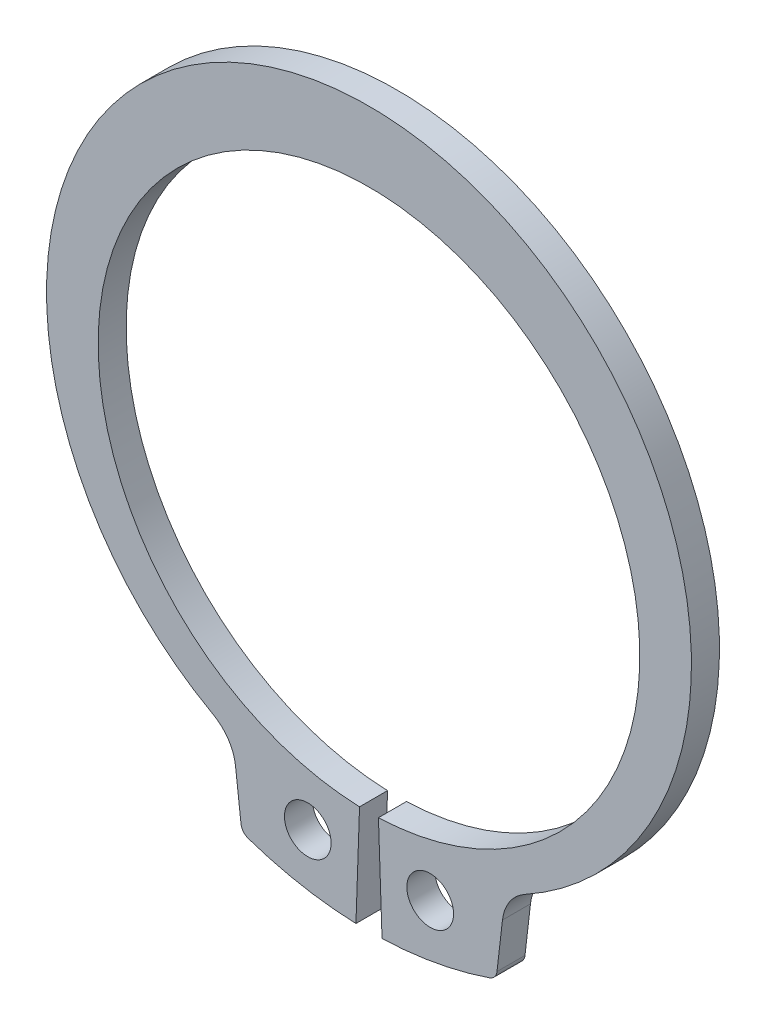
ISO-10303-21;
HEADER;
FILE_DESCRIPTION(('STEP AP214'),'2;1');
FILE_NAME('part.step','',(''),(''),'','','');
FILE_SCHEMA(('AUTOMOTIVE_DESIGN { 1 0 10303 214 1 1 1 1 }'));
ENDSEC;
DATA;
#1=APPLICATION_CONTEXT('core data for automotive mechanical design processes');
#2=APPLICATION_PROTOCOL_DEFINITION('international standard','automotive_design',2000,#1);
#3=PRODUCT_CONTEXT('',#1,'mechanical');
#4=PRODUCT('Part','Part','',(#3));
#5=PRODUCT_RELATED_PRODUCT_CATEGORY('part','',(#4));
#6=PRODUCT_DEFINITION_FORMATION('','',#4);
#7=PRODUCT_DEFINITION_CONTEXT('part definition',#1,'design');
#8=PRODUCT_DEFINITION('design','',#6,#7);
#9=PRODUCT_DEFINITION_SHAPE('','',#8);
#10=(LENGTH_UNIT() NAMED_UNIT(*) SI_UNIT(.MILLI.,.METRE.));
#11=(NAMED_UNIT(*) PLANE_ANGLE_UNIT() SI_UNIT($,.RADIAN.));
#12=(NAMED_UNIT(*) SI_UNIT($,.STERADIAN.) SOLID_ANGLE_UNIT());
#13=UNCERTAINTY_MEASURE_WITH_UNIT(LENGTH_MEASURE(1.E-05),#10,'distance_accuracy_value','');
#14=(GEOMETRIC_REPRESENTATION_CONTEXT(3) GLOBAL_UNCERTAINTY_ASSIGNED_CONTEXT((#13)) GLOBAL_UNIT_ASSIGNED_CONTEXT((#10,
#11,#12)) REPRESENTATION_CONTEXT('',''));
#15=CARTESIAN_POINT('',(0.,0.,0.));
#16=DIRECTION('',(0.,0.,1.));
#17=DIRECTION('',(1.,0.,0.));
#18=AXIS2_PLACEMENT_3D('',#15,#16,#17);
#19=CARTESIAN_POINT('',(0.,0.789014919272689,0.6));
#20=DIRECTION('',(0.,0.,1.));
#21=DIRECTION('',(1.,0.,0.));
#22=AXIS2_PLACEMENT_3D('',#19,#20,#21);
#23=PLANE('',#22);
#24=DIRECTION('',(0.114755989276099,-0.993393709928377,0.));
#25=VECTOR('',#24,1.);
#26=CARTESIAN_POINT('',(-5.44782224700734,-15.054348692698,0.6));
#27=LINE('',#26,#25);
#28=CARTESIAN_POINT('',(-5.7159600551779,-12.73319392151,0.6));
#29=VERTEX_POINT('',#28);
#30=CARTESIAN_POINT('',(-5.48160242267213,-14.7619281032598,0.6));
#31=VERTEX_POINT('',#30);
#32=EDGE_CURVE('E189',#29,#31,#27,.T.);
#33=ORIENTED_EDGE('',*,*,#32,.T.);
#34=CARTESIAN_POINT('',(-5.01405938593886,-14.7079179326968,0.6));
#35=DIRECTION('',(0.,0.,1.));
#36=DIRECTION('',(1.,0.,0.));
#37=AXIS2_PLACEMENT_3D('',#34,#35,#36);
#38=CIRCLE('',#37,0.470652302365579);
#39=CARTESIAN_POINT('',(-5.16592651675523,-15.1533951647745,0.6));
#40=VERTEX_POINT('',#39);
#41=EDGE_CURVE('E12',#31,#40,#38,.T.);
#42=ORIENTED_EDGE('',*,*,#41,.T.);
#43=CARTESIAN_POINT('',(0.,0.,0.6));
#44=DIRECTION('',(0.,0.,1.));
#45=DIRECTION('',(1.,0.,0.));
#46=AXIS2_PLACEMENT_3D('',#43,#44,#45);
#47=CIRCLE('',#46,16.0097527087811);
#48=CARTESIAN_POINT('',(-0.558732311867989,-16.,0.6));
#49=VERTEX_POINT('',#48);
#50=EDGE_CURVE('E192',#40,#49,#47,.T.);
#51=ORIENTED_EDGE('',*,*,#50,.T.);
#52=DIRECTION('',(0.0348994967025029,0.999390827019096,0.));
#53=VECTOR('',#52,1.);
#54=CARTESIAN_POINT('',(-0.558732311867989,-16.,0.6));
#55=LINE('',#54,#53);
#56=CARTESIAN_POINT('',(-0.404834161749029,-11.5929335934215,0.6));
#57=VERTEX_POINT('',#56);
#58=EDGE_CURVE('E194',#49,#57,#55,.T.);
#59=ORIENTED_EDGE('',*,*,#58,.T.);
#60=CARTESIAN_POINT('',(0.,0.,0.6));
#61=DIRECTION('',(0.,0.,-1.));
#62=DIRECTION('',(1.,0.,0.));
#63=AXIS2_PLACEMENT_3D('',#60,#61,#62);
#64=CIRCLE('',#63,11.6);
#65=CARTESIAN_POINT('',(0.404834161749023,-11.5929335934215,0.6));
#66=VERTEX_POINT('',#65);
#67=EDGE_CURVE('E148',#57,#66,#64,.T.);
#68=ORIENTED_EDGE('',*,*,#67,.T.);
#69=DIRECTION('',(-0.0348994967025024,0.999390827019096,0.));
#70=VECTOR('',#69,1.);
#71=CARTESIAN_POINT('',(0.55873231186798,-16.,0.6));
#72=LINE('',#71,#70);
#73=CARTESIAN_POINT('',(0.55873231186798,-16.,0.6));
#74=VERTEX_POINT('',#73);
#75=EDGE_CURVE('E128',#74,#66,#72,.T.);
#76=ORIENTED_EDGE('',*,*,#75,.F.);
#77=CARTESIAN_POINT('',(0.,0.,0.6));
#78=DIRECTION('',(0.,0.,-1.));
#79=DIRECTION('',(-1.,0.,0.));
#80=AXIS2_PLACEMENT_3D('',#77,#78,#79);
#81=CIRCLE('',#80,16.0097527087811);
#82=CARTESIAN_POINT('',(5.16592651675522,-15.1533951647745,0.6));
#83=VERTEX_POINT('',#82);
#84=EDGE_CURVE('E138',#83,#74,#81,.T.);
#85=ORIENTED_EDGE('',*,*,#84,.F.);
#86=CARTESIAN_POINT('',(5.01405938593885,-14.7079179326968,0.6));
#87=DIRECTION('',(0.,0.,-1.));
#88=DIRECTION('',(-1.,0.,0.));
#89=AXIS2_PLACEMENT_3D('',#86,#87,#88);
#90=CIRCLE('',#89,0.470652302365579);
#91=CARTESIAN_POINT('',(5.48160242267212,-14.7619281032598,0.6));
#92=VERTEX_POINT('',#91);
#93=EDGE_CURVE('E177',#92,#83,#90,.T.);
#94=ORIENTED_EDGE('',*,*,#93,.F.);
#95=DIRECTION('',(-0.1147559892761,-0.993393709928377,0.));
#96=VECTOR('',#95,1.);
#97=CARTESIAN_POINT('',(5.44782224700733,-15.054348692698,0.6));
#98=LINE('',#97,#96);
#99=CARTESIAN_POINT('',(5.71596005517789,-12.73319392151,0.6));
#100=VERTEX_POINT('',#99);
#101=EDGE_CURVE('E144',#100,#92,#98,.T.);
#102=ORIENTED_EDGE('',*,*,#101,.F.);
#103=CARTESIAN_POINT('',(7.58613220211099,-12.9492346037622,0.6));
#104=DIRECTION('',(0.,0.,-1.));
#105=DIRECTION('',(-1.,0.,0.));
#106=AXIS2_PLACEMENT_3D('',#103,#104,#105);
#107=CIRCLE('',#106,1.88260920946232);
#108=CARTESIAN_POINT('',(6.67609705759215,-11.3011892550861,0.6));
#109=VERTEX_POINT('',#108);
#110=EDGE_CURVE('E168',#109,#100,#107,.F.);
#111=ORIENTED_EDGE('',*,*,#110,.F.);
#112=CARTESIAN_POINT('',(0.,0.789014919272689,0.6));
#113=DIRECTION('',(0.,0.,1.));
#114=DIRECTION('',(1.,0.,0.));
#115=AXIS2_PLACEMENT_3D('',#112,#113,#114);
#116=CIRCLE('',#115,13.8109850807273);
#117=CARTESIAN_POINT('',(-6.67609705759215,-11.3011892550861,0.6));
#118=VERTEX_POINT('',#117);
#119=EDGE_CURVE('E186',#109,#118,#116,.T.);
#120=ORIENTED_EDGE('',*,*,#119,.T.);
#121=CARTESIAN_POINT('',(-7.586132202111,-12.9492346037622,0.6));
#122=DIRECTION('',(0.,0.,1.));
#123=DIRECTION('',(1.,0.,0.));
#124=AXIS2_PLACEMENT_3D('',#121,#122,#123);
#125=CIRCLE('',#124,1.88260920946232);
#126=EDGE_CURVE('E219',#118,#29,#125,.F.);
#127=ORIENTED_EDGE('',*,*,#126,.T.);
#128=EDGE_LOOP('',(#33,#42,#51,#59,#68,#76,#85,#94,#102,#111,#120,#127));
#129=FACE_BOUND('',#128,.T.);
#130=CARTESIAN_POINT('',(-2.62156105906442,-13.5536721508825,0.6));
#131=DIRECTION('',(0.,0.,1.));
#132=DIRECTION('',(1.,0.,0.));
#133=AXIS2_PLACEMENT_3D('',#130,#131,#132);
#134=CIRCLE('',#133,1.);
#135=CARTESIAN_POINT('',(-1.62156105906442,-13.5536721508825,0.6));
#136=VERTEX_POINT('',#135);
#137=EDGE_CURVE('E180',#136,#136,#134,.T.);
#138=ORIENTED_EDGE('',*,*,#137,.F.);
#139=EDGE_LOOP('',(#138));
#140=FACE_BOUND('',#139,.T.);
#141=CARTESIAN_POINT('',(2.62156105906441,-13.5536721508825,0.6));
#142=DIRECTION('',(0.,0.,-1.));
#143=DIRECTION('',(-1.,0.,0.));
#144=AXIS2_PLACEMENT_3D('',#141,#142,#143);
#145=CIRCLE('',#144,1.);
#146=CARTESIAN_POINT('',(1.62156105906441,-13.5536721508825,0.6));
#147=VERTEX_POINT('',#146);
#148=EDGE_CURVE('E158',#147,#147,#145,.T.);
#149=ORIENTED_EDGE('',*,*,#148,.T.);
#150=EDGE_LOOP('',(#149));
#151=FACE_BOUND('',#150,.T.);
#152=ADVANCED_FACE('F34',(#129,#140,#151),#23,.T.);
#153=CARTESIAN_POINT('',(0.,0.789014919272689,-0.6));
#154=DIRECTION('',(0.,0.,1.));
#155=DIRECTION('',(1.,0.,0.));
#156=AXIS2_PLACEMENT_3D('',#153,#154,#155);
#157=PLANE('',#156);
#158=CARTESIAN_POINT('',(0.,0.,-0.6));
#159=DIRECTION('',(0.,0.,1.));
#160=DIRECTION('',(1.,0.,0.));
#161=AXIS2_PLACEMENT_3D('',#158,#159,#160);
#162=CIRCLE('',#161,16.0097527087811);
#163=CARTESIAN_POINT('',(-5.16592651675523,-15.1533951647745,-0.6));
#164=VERTEX_POINT('',#163);
#165=CARTESIAN_POINT('',(-0.558732311867989,-16.,-0.6));
#166=VERTEX_POINT('',#165);
#167=EDGE_CURVE('E202',#164,#166,#162,.T.);
#168=ORIENTED_EDGE('',*,*,#167,.F.);
#169=CARTESIAN_POINT('',(-5.01405938593886,-14.7079179326968,-0.6));
#170=DIRECTION('',(0.,0.,1.));
#171=DIRECTION('',(1.,0.,0.));
#172=AXIS2_PLACEMENT_3D('',#169,#170,#171);
#173=CIRCLE('',#172,0.470652302365579);
#174=CARTESIAN_POINT('',(-5.48160242267213,-14.7619281032598,-0.6));
#175=VERTEX_POINT('',#174);
#176=EDGE_CURVE('E56',#164,#175,#173,.F.);
#177=ORIENTED_EDGE('',*,*,#176,.T.);
#178=DIRECTION('',(0.114755989276099,-0.993393709928377,0.));
#179=VECTOR('',#178,1.);
#180=CARTESIAN_POINT('',(-5.44782224700734,-15.054348692698,-0.6));
#181=LINE('',#180,#179);
#182=CARTESIAN_POINT('',(-5.7159600551779,-12.73319392151,-0.6));
#183=VERTEX_POINT('',#182);
#184=EDGE_CURVE('E200',#183,#175,#181,.T.);
#185=ORIENTED_EDGE('',*,*,#184,.F.);
#186=CARTESIAN_POINT('',(-7.586132202111,-12.9492346037622,-0.6));
#187=DIRECTION('',(0.,0.,1.));
#188=DIRECTION('',(1.,0.,0.));
#189=AXIS2_PLACEMENT_3D('',#186,#187,#188);
#190=CIRCLE('',#189,1.88260920946232);
#191=CARTESIAN_POINT('',(-6.67609705759215,-11.3011892550861,-0.6));
#192=VERTEX_POINT('',#191);
#193=EDGE_CURVE('E217',#183,#192,#190,.T.);
#194=ORIENTED_EDGE('',*,*,#193,.T.);
#195=CARTESIAN_POINT('',(0.,0.789014919272689,-0.6));
#196=DIRECTION('',(0.,0.,1.));
#197=DIRECTION('',(1.,0.,0.));
#198=AXIS2_PLACEMENT_3D('',#195,#196,#197);
#199=CIRCLE('',#198,13.8109850807273);
#200=CARTESIAN_POINT('',(6.67609705759215,-11.3011892550861,-0.6));
#201=VERTEX_POINT('',#200);
#202=EDGE_CURVE('E183',#201,#192,#199,.T.);
#203=ORIENTED_EDGE('',*,*,#202,.F.);
#204=CARTESIAN_POINT('',(7.58613220211099,-12.9492346037622,-0.6));
#205=DIRECTION('',(0.,0.,-1.));
#206=DIRECTION('',(-1.,0.,0.));
#207=AXIS2_PLACEMENT_3D('',#204,#205,#206);
#208=CIRCLE('',#207,1.88260920946232);
#209=CARTESIAN_POINT('',(5.71596005517789,-12.73319392151,-0.6));
#210=VERTEX_POINT('',#209);
#211=EDGE_CURVE('E165',#210,#201,#208,.T.);
#212=ORIENTED_EDGE('',*,*,#211,.F.);
#213=DIRECTION('',(-0.1147559892761,-0.993393709928377,0.));
#214=VECTOR('',#213,1.);
#215=CARTESIAN_POINT('',(5.44782224700733,-15.054348692698,-0.6));
#216=LINE('',#215,#214);
#217=CARTESIAN_POINT('',(5.48160242267212,-14.7619281032598,-0.6));
#218=VERTEX_POINT('',#217);
#219=EDGE_CURVE('E154',#210,#218,#216,.T.);
#220=ORIENTED_EDGE('',*,*,#219,.T.);
#221=CARTESIAN_POINT('',(5.01405938593885,-14.7079179326968,-0.6));
#222=DIRECTION('',(0.,0.,-1.));
#223=DIRECTION('',(-1.,0.,0.));
#224=AXIS2_PLACEMENT_3D('',#221,#222,#223);
#225=CIRCLE('',#224,0.470652302365579);
#226=CARTESIAN_POINT('',(5.16592651675522,-15.1533951647745,-0.6));
#227=VERTEX_POINT('',#226);
#228=EDGE_CURVE('E172',#227,#218,#225,.F.);
#229=ORIENTED_EDGE('',*,*,#228,.F.);
#230=CARTESIAN_POINT('',(0.,0.,-0.6));
#231=DIRECTION('',(0.,0.,-1.));
#232=DIRECTION('',(-1.,0.,0.));
#233=AXIS2_PLACEMENT_3D('',#230,#231,#232);
#234=CIRCLE('',#233,16.0097527087811);
#235=CARTESIAN_POINT('',(0.55873231186798,-16.,-0.6));
#236=VERTEX_POINT('',#235);
#237=EDGE_CURVE('E157',#227,#236,#234,.T.);
#238=ORIENTED_EDGE('',*,*,#237,.T.);
#239=DIRECTION('',(-0.0348994967025024,0.999390827019096,0.));
#240=VECTOR('',#239,1.);
#241=CARTESIAN_POINT('',(0.55873231186798,-16.,-0.6));
#242=LINE('',#241,#240);
#243=CARTESIAN_POINT('',(0.404834161749023,-11.5929335934215,-0.6));
#244=VERTEX_POINT('',#243);
#245=EDGE_CURVE('E130',#236,#244,#242,.T.);
#246=ORIENTED_EDGE('',*,*,#245,.T.);
#247=CARTESIAN_POINT('',(0.,0.,-0.6));
#248=DIRECTION('',(0.,0.,-1.));
#249=DIRECTION('',(1.,0.,0.));
#250=AXIS2_PLACEMENT_3D('',#247,#248,#249);
#251=CIRCLE('',#250,11.6);
#252=CARTESIAN_POINT('',(-0.404834161749029,-11.5929335934215,-0.6));
#253=VERTEX_POINT('',#252);
#254=EDGE_CURVE('E190',#253,#244,#251,.T.);
#255=ORIENTED_EDGE('',*,*,#254,.F.);
#256=DIRECTION('',(0.0348994967025029,0.999390827019096,0.));
#257=VECTOR('',#256,1.);
#258=CARTESIAN_POINT('',(-0.558732311867989,-16.,-0.6));
#259=LINE('',#258,#257);
#260=EDGE_CURVE('E204',#166,#253,#259,.T.);
#261=ORIENTED_EDGE('',*,*,#260,.F.);
#262=EDGE_LOOP('',(#168,#177,#185,#194,#203,#212,#220,#229,#238,#246,#255,#261));
#263=FACE_BOUND('',#262,.T.);
#264=CARTESIAN_POINT('',(-2.62156105906442,-13.5536721508825,-0.6));
#265=DIRECTION('',(0.,0.,1.));
#266=DIRECTION('',(1.,0.,0.));
#267=AXIS2_PLACEMENT_3D('',#264,#265,#266);
#268=CIRCLE('',#267,1.);
#269=CARTESIAN_POINT('',(-1.62156105906442,-13.5536721508825,-0.6));
#270=VERTEX_POINT('',#269);
#271=EDGE_CURVE('E179',#270,#270,#268,.T.);
#272=ORIENTED_EDGE('',*,*,#271,.T.);
#273=EDGE_LOOP('',(#272));
#274=FACE_BOUND('',#273,.T.);
#275=CARTESIAN_POINT('',(2.62156105906441,-13.5536721508825,-0.6));
#276=DIRECTION('',(0.,0.,-1.));
#277=DIRECTION('',(-1.,0.,0.));
#278=AXIS2_PLACEMENT_3D('',#275,#276,#277);
#279=CIRCLE('',#278,1.);
#280=CARTESIAN_POINT('',(1.62156105906441,-13.5536721508825,-0.6));
#281=VERTEX_POINT('',#280);
#282=EDGE_CURVE('E252',#281,#281,#279,.T.);
#283=ORIENTED_EDGE('',*,*,#282,.F.);
#284=EDGE_LOOP('',(#283));
#285=FACE_BOUND('',#284,.T.);
#286=ADVANCED_FACE('F232',(#263,#274,#285),#157,.F.);
#287=CARTESIAN_POINT('',(0.,0.789014919272689,0.6));
#288=DIRECTION('',(0.,0.,-1.));
#289=DIRECTION('',(-1.,0.,0.));
#290=AXIS2_PLACEMENT_3D('',#287,#288,#289);
#291=CYLINDRICAL_SURFACE('',#290,13.8109850807273);
#292=ORIENTED_EDGE('',*,*,#202,.T.);
#293=DIRECTION('',(0.,0.,-1.));
#294=VECTOR('',#293,1.);
#295=CARTESIAN_POINT('',(-6.67609705759215,-11.3011892550861,0.6));
#296=LINE('',#295,#294);
#297=EDGE_CURVE('E215',#192,#118,#296,.F.);
#298=ORIENTED_EDGE('',*,*,#297,.T.);
#299=ORIENTED_EDGE('',*,*,#119,.F.);
#300=DIRECTION('',(0.,0.,-1.));
#301=VECTOR('',#300,1.);
#302=CARTESIAN_POINT('',(6.67609705759215,-11.3011892550861,0.6));
#303=LINE('',#302,#301);
#304=EDGE_CURVE('E162',#201,#109,#303,.F.);
#305=ORIENTED_EDGE('',*,*,#304,.F.);
#306=EDGE_LOOP('',(#292,#298,#299,#305));
#307=FACE_BOUND('',#306,.T.);
#308=ADVANCED_FACE('F267',(#307),#291,.T.);
#309=CARTESIAN_POINT('',(-5.44782224700734,-15.054348692698,0.6));
#310=DIRECTION('',(0.993393709928377,0.114755989276099,0.));
#311=DIRECTION('',(-0.114755989276099,0.993393709928377,0.));
#312=AXIS2_PLACEMENT_3D('',#309,#310,#311);
#313=PLANE('',#312);
#314=ORIENTED_EDGE('',*,*,#184,.T.);
#315=DIRECTION('',(0.,0.,-1.));
#316=VECTOR('',#315,1.);
#317=CARTESIAN_POINT('',(-5.48160242267213,-14.7619281032598,0.6));
#318=LINE('',#317,#316);
#319=EDGE_CURVE('E42',#175,#31,#318,.F.);
#320=ORIENTED_EDGE('',*,*,#319,.T.);
#321=ORIENTED_EDGE('',*,*,#32,.F.);
#322=DIRECTION('',(0.,0.,1.));
#323=VECTOR('',#322,1.);
#324=CARTESIAN_POINT('',(-5.7159600551779,-12.73319392151,-0.6));
#325=LINE('',#324,#323);
#326=EDGE_CURVE('E212',#29,#183,#325,.F.);
#327=ORIENTED_EDGE('',*,*,#326,.T.);
#328=EDGE_LOOP('',(#314,#320,#321,#327));
#329=FACE_BOUND('',#328,.T.);
#330=ADVANCED_FACE('F273',(#329),#313,.F.);
#331=CARTESIAN_POINT('',(0.,0.,0.6));
#332=DIRECTION('',(0.,0.,-1.));
#333=DIRECTION('',(-1.,0.,0.));
#334=AXIS2_PLACEMENT_3D('',#331,#332,#333);
#335=CYLINDRICAL_SURFACE('',#334,16.0097527087811);
#336=ORIENTED_EDGE('',*,*,#50,.F.);
#337=DIRECTION('',(0.,0.,-1.));
#338=VECTOR('',#337,1.);
#339=CARTESIAN_POINT('',(-5.16592651675523,-15.1533951647745,0.6));
#340=LINE('',#339,#338);
#341=EDGE_CURVE('E221',#40,#164,#340,.T.);
#342=ORIENTED_EDGE('',*,*,#341,.T.);
#343=ORIENTED_EDGE('',*,*,#167,.T.);
#344=DIRECTION('',(0.,0.,-1.));
#345=VECTOR('',#344,1.);
#346=CARTESIAN_POINT('',(-0.558732311867989,-16.,0.6));
#347=LINE('',#346,#345);
#348=EDGE_CURVE('E209',#49,#166,#347,.T.);
#349=ORIENTED_EDGE('',*,*,#348,.F.);
#350=EDGE_LOOP('',(#336,#342,#343,#349));
#351=FACE_BOUND('',#350,.T.);
#352=ADVANCED_FACE('F227',(#351),#335,.T.);
#353=CARTESIAN_POINT('',(-0.558732311867989,-16.,0.6));
#354=DIRECTION('',(-0.999390827019096,0.0348994967025029,0.));
#355=DIRECTION('',(-0.0348994967025029,-0.999390827019096,0.));
#356=AXIS2_PLACEMENT_3D('',#353,#354,#355);
#357=PLANE('',#356);
#358=ORIENTED_EDGE('',*,*,#260,.T.);
#359=DIRECTION('',(0.,0.,-1.));
#360=VECTOR('',#359,1.);
#361=CARTESIAN_POINT('',(-0.404834161749029,-11.5929335934215,0.6));
#362=LINE('',#361,#360);
#363=EDGE_CURVE('E197',#57,#253,#362,.T.);
#364=ORIENTED_EDGE('',*,*,#363,.F.);
#365=ORIENTED_EDGE('',*,*,#58,.F.);
#366=ORIENTED_EDGE('',*,*,#348,.T.);
#367=EDGE_LOOP('',(#358,#364,#365,#366));
#368=FACE_BOUND('',#367,.T.);
#369=ADVANCED_FACE('F237',(#368),#357,.F.);
#370=CARTESIAN_POINT('',(0.,0.,0.6));
#371=DIRECTION('',(0.,0.,-1.));
#372=DIRECTION('',(-1.,0.,0.));
#373=AXIS2_PLACEMENT_3D('',#370,#371,#372);
#374=CYLINDRICAL_SURFACE('',#373,11.6);
#375=ORIENTED_EDGE('',*,*,#254,.T.);
#376=DIRECTION('',(0.,0.,-1.));
#377=VECTOR('',#376,1.);
#378=CARTESIAN_POINT('',(0.404834161749023,-11.5929335934215,0.6));
#379=LINE('',#378,#377);
#380=EDGE_CURVE('E135',#66,#244,#379,.T.);
#381=ORIENTED_EDGE('',*,*,#380,.F.);
#382=ORIENTED_EDGE('',*,*,#67,.F.);
#383=ORIENTED_EDGE('',*,*,#363,.T.);
#384=EDGE_LOOP('',(#375,#381,#382,#383));
#385=FACE_BOUND('',#384,.T.);
#386=ADVANCED_FACE('F240',(#385),#374,.F.);
#387=CARTESIAN_POINT('',(-2.62156105906442,-13.5536721508825,0.6));
#388=DIRECTION('',(0.,0.,-1.));
#389=DIRECTION('',(-1.,0.,0.));
#390=AXIS2_PLACEMENT_3D('',#387,#388,#389);
#391=CYLINDRICAL_SURFACE('',#390,1.);
#392=ORIENTED_EDGE('',*,*,#137,.T.);
#393=EDGE_LOOP('',(#392));
#394=FACE_BOUND('',#393,.T.);
#395=ORIENTED_EDGE('',*,*,#271,.F.);
#396=EDGE_LOOP('',(#395));
#397=FACE_BOUND('',#396,.T.);
#398=ADVANCED_FACE('F281',(#394,#397),#391,.F.);
#399=CARTESIAN_POINT('',(-7.586132202111,-12.9492346037622,0.6));
#400=DIRECTION('',(0.,0.,-1.));
#401=DIRECTION('',(-1.,0.,0.));
#402=AXIS2_PLACEMENT_3D('',#399,#400,#401);
#403=CYLINDRICAL_SURFACE('',#402,1.88260920946232);
#404=ORIENTED_EDGE('',*,*,#126,.F.);
#405=ORIENTED_EDGE('',*,*,#297,.F.);
#406=ORIENTED_EDGE('',*,*,#193,.F.);
#407=ORIENTED_EDGE('',*,*,#326,.F.);
#408=EDGE_LOOP('',(#404,#405,#406,#407));
#409=FACE_BOUND('',#408,.T.);
#410=ADVANCED_FACE('F287',(#409),#403,.F.);
#411=CARTESIAN_POINT('',(-5.01405938593886,-14.7079179326968,0.6));
#412=DIRECTION('',(0.,0.,-1.));
#413=DIRECTION('',(-1.,0.,0.));
#414=AXIS2_PLACEMENT_3D('',#411,#412,#413);
#415=CYLINDRICAL_SURFACE('',#414,0.470652302365579);
#416=ORIENTED_EDGE('',*,*,#41,.F.);
#417=ORIENTED_EDGE('',*,*,#319,.F.);
#418=ORIENTED_EDGE('',*,*,#176,.F.);
#419=ORIENTED_EDGE('',*,*,#341,.F.);
#420=EDGE_LOOP('',(#416,#417,#418,#419));
#421=FACE_BOUND('',#420,.T.);
#422=ADVANCED_FACE('F36',(#421),#415,.T.);
#423=CARTESIAN_POINT('',(5.44782224700733,-15.054348692698,0.6));
#424=DIRECTION('',(-0.993393709928377,0.1147559892761,0.));
#425=DIRECTION('',(0.1147559892761,0.993393709928377,0.));
#426=AXIS2_PLACEMENT_3D('',#423,#424,#425);
#427=PLANE('',#426);
#428=ORIENTED_EDGE('',*,*,#219,.F.);
#429=DIRECTION('',(0.,0.,1.));
#430=VECTOR('',#429,1.);
#431=CARTESIAN_POINT('',(5.71596005517789,-12.73319392151,-0.6));
#432=LINE('',#431,#430);
#433=EDGE_CURVE('E134',#100,#210,#432,.F.);
#434=ORIENTED_EDGE('',*,*,#433,.F.);
#435=ORIENTED_EDGE('',*,*,#101,.T.);
#436=DIRECTION('',(0.,0.,-1.));
#437=VECTOR('',#436,1.);
#438=CARTESIAN_POINT('',(5.48160242267212,-14.7619281032598,0.6));
#439=LINE('',#438,#437);
#440=EDGE_CURVE('E175',#218,#92,#439,.F.);
#441=ORIENTED_EDGE('',*,*,#440,.F.);
#442=EDGE_LOOP('',(#428,#434,#435,#441));
#443=FACE_BOUND('',#442,.T.);
#444=ADVANCED_FACE('F250',(#443),#427,.F.);
#445=CARTESIAN_POINT('',(0.,0.,0.6));
#446=DIRECTION('',(0.,0.,-1.));
#447=DIRECTION('',(1.,0.,0.));
#448=AXIS2_PLACEMENT_3D('',#445,#446,#447);
#449=CYLINDRICAL_SURFACE('',#448,16.0097527087811);
#450=ORIENTED_EDGE('',*,*,#84,.T.);
#451=DIRECTION('',(0.,0.,-1.));
#452=VECTOR('',#451,1.);
#453=CARTESIAN_POINT('',(0.55873231186798,-16.,0.6));
#454=LINE('',#453,#452);
#455=EDGE_CURVE('E123',#74,#236,#454,.T.);
#456=ORIENTED_EDGE('',*,*,#455,.T.);
#457=ORIENTED_EDGE('',*,*,#237,.F.);
#458=DIRECTION('',(0.,0.,-1.));
#459=VECTOR('',#458,1.);
#460=CARTESIAN_POINT('',(5.16592651675522,-15.1533951647745,0.6));
#461=LINE('',#460,#459);
#462=EDGE_CURVE('E140',#83,#227,#461,.T.);
#463=ORIENTED_EDGE('',*,*,#462,.F.);
#464=EDGE_LOOP('',(#450,#456,#457,#463));
#465=FACE_BOUND('',#464,.T.);
#466=ADVANCED_FACE('F139',(#465),#449,.T.);
#467=CARTESIAN_POINT('',(0.55873231186798,-16.,0.6));
#468=DIRECTION('',(0.999390827019096,0.0348994967025024,0.));
#469=DIRECTION('',(0.0348994967025024,-0.999390827019096,0.));
#470=AXIS2_PLACEMENT_3D('',#467,#468,#469);
#471=PLANE('',#470);
#472=ORIENTED_EDGE('',*,*,#245,.F.);
#473=ORIENTED_EDGE('',*,*,#455,.F.);
#474=ORIENTED_EDGE('',*,*,#75,.T.);
#475=ORIENTED_EDGE('',*,*,#380,.T.);
#476=EDGE_LOOP('',(#472,#473,#474,#475));
#477=FACE_BOUND('',#476,.T.);
#478=ADVANCED_FACE('F125',(#477),#471,.F.);
#479=CARTESIAN_POINT('',(2.62156105906441,-13.5536721508825,0.6));
#480=DIRECTION('',(0.,0.,-1.));
#481=DIRECTION('',(1.,0.,0.));
#482=AXIS2_PLACEMENT_3D('',#479,#480,#481);
#483=CYLINDRICAL_SURFACE('',#482,1.);
#484=ORIENTED_EDGE('',*,*,#148,.F.);
#485=EDGE_LOOP('',(#484));
#486=FACE_BOUND('',#485,.T.);
#487=ORIENTED_EDGE('',*,*,#282,.T.);
#488=EDGE_LOOP('',(#487));
#489=FACE_BOUND('',#488,.T.);
#490=ADVANCED_FACE('F259',(#486,#489),#483,.F.);
#491=CARTESIAN_POINT('',(7.58613220211099,-12.9492346037622,0.6));
#492=DIRECTION('',(0.,0.,-1.));
#493=DIRECTION('',(1.,0.,0.));
#494=AXIS2_PLACEMENT_3D('',#491,#492,#493);
#495=CYLINDRICAL_SURFACE('',#494,1.88260920946232);
#496=ORIENTED_EDGE('',*,*,#110,.T.);
#497=ORIENTED_EDGE('',*,*,#433,.T.);
#498=ORIENTED_EDGE('',*,*,#211,.T.);
#499=ORIENTED_EDGE('',*,*,#304,.T.);
#500=EDGE_LOOP('',(#496,#497,#498,#499));
#501=FACE_BOUND('',#500,.T.);
#502=ADVANCED_FACE('F262',(#501),#495,.F.);
#503=CARTESIAN_POINT('',(5.01405938593885,-14.7079179326968,0.6));
#504=DIRECTION('',(0.,0.,-1.));
#505=DIRECTION('',(1.,0.,0.));
#506=AXIS2_PLACEMENT_3D('',#503,#504,#505);
#507=CYLINDRICAL_SURFACE('',#506,0.470652302365579);
#508=ORIENTED_EDGE('',*,*,#93,.T.);
#509=ORIENTED_EDGE('',*,*,#462,.T.);
#510=ORIENTED_EDGE('',*,*,#228,.T.);
#511=ORIENTED_EDGE('',*,*,#440,.T.);
#512=EDGE_LOOP('',(#508,#509,#510,#511));
#513=FACE_BOUND('',#512,.T.);
#514=ADVANCED_FACE('F245',(#513),#507,.T.);
#515=CLOSED_SHELL('',(#152,#286,#308,#330,#352,#369,#386,#398,#410,#422,#444,#466,#478,#490,
#502,#514));
#516=MANIFOLD_SOLID_BREP('B2',#515);
#517=ADVANCED_BREP_SHAPE_REPRESENTATION('',(#18,#516),#14);
#518=SHAPE_DEFINITION_REPRESENTATION(#9,#517);
ENDSEC;
END-ISO-10303-21;
